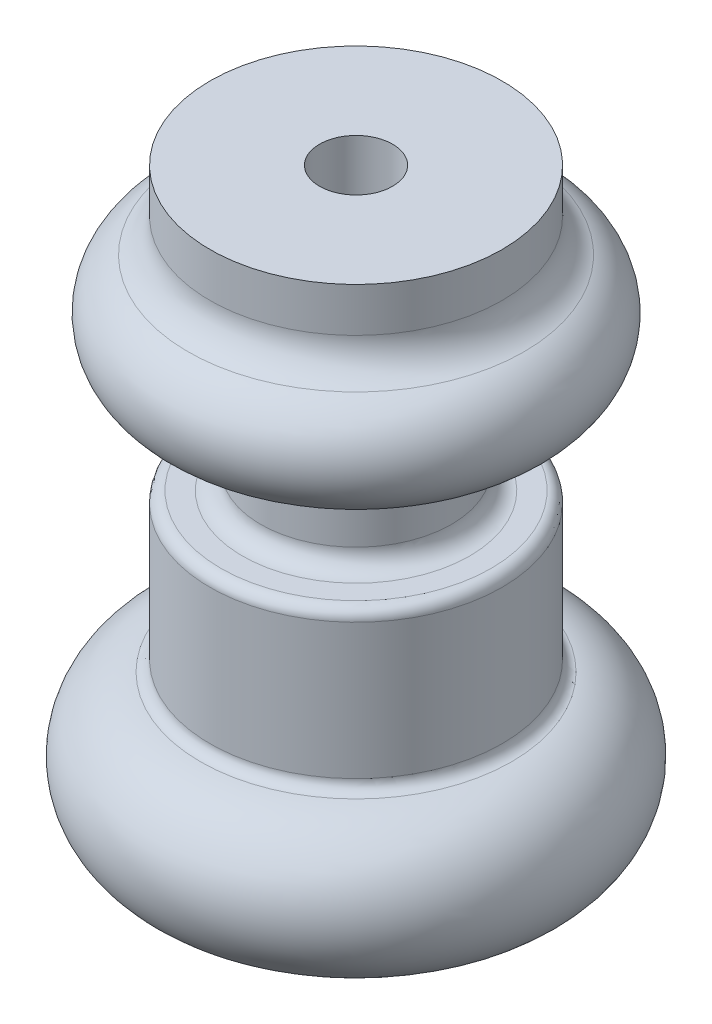
ISO-10303-21;
HEADER;
FILE_DESCRIPTION(('STEP AP214'),'2;1');
FILE_NAME('part.step','',(''),(''),'','','');
FILE_SCHEMA(('AUTOMOTIVE_DESIGN { 1 0 10303 214 1 1 1 1 }'));
ENDSEC;
DATA;
#1=APPLICATION_CONTEXT('core data for automotive mechanical design processes');
#2=APPLICATION_PROTOCOL_DEFINITION('international standard','automotive_design',2000,#1);
#3=PRODUCT_CONTEXT('',#1,'mechanical');
#4=PRODUCT('Part','Part','',(#3));
#5=PRODUCT_RELATED_PRODUCT_CATEGORY('part','',(#4));
#6=PRODUCT_DEFINITION_FORMATION('','',#4);
#7=PRODUCT_DEFINITION_CONTEXT('part definition',#1,'design');
#8=PRODUCT_DEFINITION('design','',#6,#7);
#9=PRODUCT_DEFINITION_SHAPE('','',#8);
#10=(LENGTH_UNIT() NAMED_UNIT(*) SI_UNIT(.MILLI.,.METRE.));
#11=(NAMED_UNIT(*) PLANE_ANGLE_UNIT() SI_UNIT($,.RADIAN.));
#12=(NAMED_UNIT(*) SI_UNIT($,.STERADIAN.) SOLID_ANGLE_UNIT());
#13=UNCERTAINTY_MEASURE_WITH_UNIT(LENGTH_MEASURE(1.E-05),#10,'distance_accuracy_value','');
#14=(GEOMETRIC_REPRESENTATION_CONTEXT(3) GLOBAL_UNCERTAINTY_ASSIGNED_CONTEXT((#13)) GLOBAL_UNIT_ASSIGNED_CONTEXT((#10,
#11,#12)) REPRESENTATION_CONTEXT('',''));
#15=CARTESIAN_POINT('',(0.,0.,0.));
#16=DIRECTION('',(0.,0.,1.));
#17=DIRECTION('',(1.,0.,0.));
#18=AXIS2_PLACEMENT_3D('',#15,#16,#17);
#19=CARTESIAN_POINT('',(0.,0.,0.));
#20=DIRECTION('',(0.,-1.,0.));
#21=DIRECTION('',(1.,0.,0.));
#22=AXIS2_PLACEMENT_3D('',#19,#20,#21);
#23=PLANE('',#22);
#24=CARTESIAN_POINT('',(0.,-2.22044604925031E-13,0.));
#25=DIRECTION('',(0.,-1.,0.));
#26=DIRECTION('',(1.,0.,0.));
#27=AXIS2_PLACEMENT_3D('',#24,#25,#26);
#28=CIRCLE('',#27,40.);
#29=CARTESIAN_POINT('',(40.,0.,0.));
#30=VERTEX_POINT('',#29);
#31=EDGE_CURVE('E10',#30,#30,#28,.T.);
#32=ORIENTED_EDGE('',*,*,#31,.T.);
#33=EDGE_LOOP('',(#32));
#34=FACE_BOUND('',#33,.T.);
#35=ADVANCED_FACE('F42',(#34),#23,.T.);
#36=CARTESIAN_POINT('',(0.,19.9999999999998,0.));
#37=DIRECTION('',(0.,-1.,0.));
#38=DIRECTION('',(1.,0.,0.));
#39=AXIS2_PLACEMENT_3D('',#36,#37,#38);
#40=TOROIDAL_SURFACE('',#39,40.0000000000001,20.);
#41=CARTESIAN_POINT('',(-1.36623860160332E-13,39.8291378278108,0.));
#42=DIRECTION('',(0.,-1.,0.));
#43=DIRECTION('',(1.,0.,0.));
#44=AXIS2_PLACEMENT_3D('',#41,#42,#43);
#45=CIRCLE('',#44,42.608695652174);
#46=CARTESIAN_POINT('',(42.6086956521739,39.829137827811,0.));
#47=VERTEX_POINT('',#46);
#48=EDGE_CURVE('E48',#47,#47,#45,.T.);
#49=ORIENTED_EDGE('',*,*,#48,.T.);
#50=EDGE_LOOP('',(#49));
#51=FACE_BOUND('',#50,.T.);
#52=ORIENTED_EDGE('',*,*,#31,.F.);
#53=EDGE_LOOP('',(#52));
#54=FACE_BOUND('',#53,.T.);
#55=ADVANCED_FACE('F179',(#51,#54),#40,.T.);
#56=CARTESIAN_POINT('',(-1.45716771982052E-13,42.8035085019825,0.));
#57=DIRECTION('',(0.,-1.,0.));
#58=DIRECTION('',(1.,0.,0.));
#59=AXIS2_PLACEMENT_3D('',#56,#57,#58);
#60=TOROIDAL_SURFACE('',#59,43.0000000000001,3.);
#61=CARTESIAN_POINT('',(-1.46826692187723E-13,42.8035085019824,0.));
#62=DIRECTION('',(0.,-1.,0.));
#63=DIRECTION('',(1.,0.,0.));
#64=AXIS2_PLACEMENT_3D('',#61,#62,#63);
#65=CIRCLE('',#64,40.0000000000002);
#66=CARTESIAN_POINT('',(40.,42.8035085019826,0.));
#67=VERTEX_POINT('',#66);
#68=EDGE_CURVE('E52',#67,#67,#65,.T.);
#69=ORIENTED_EDGE('',*,*,#68,.T.);
#70=EDGE_LOOP('',(#69));
#71=FACE_BOUND('',#70,.T.);
#72=ORIENTED_EDGE('',*,*,#48,.F.);
#73=EDGE_LOOP('',(#72));
#74=FACE_BOUND('',#73,.T.);
#75=ADVANCED_FACE('F176',(#71,#74),#60,.F.);
#76=CARTESIAN_POINT('',(4.49721271568111E-12,-1311.04555883317,0.));
#77=DIRECTION('',(0.,-1.,0.));
#78=DIRECTION('',(1.,0.,0.));
#79=AXIS2_PLACEMENT_3D('',#76,#77,#78);
#80=CYLINDRICAL_SURFACE('',#79,40.0000000000002);
#81=CARTESIAN_POINT('',(-2.74012710224512E-13,79.8812885926119,0.));
#82=DIRECTION('',(0.,-1.,0.));
#83=DIRECTION('',(1.,0.,0.));
#84=AXIS2_PLACEMENT_3D('',#81,#82,#83);
#85=CIRCLE('',#84,40.0000000000003);
#86=CARTESIAN_POINT('',(40.,79.881288592612,0.));
#87=VERTEX_POINT('',#86);
#88=EDGE_CURVE('E56',#87,#87,#85,.T.);
#89=ORIENTED_EDGE('',*,*,#88,.T.);
#90=EDGE_LOOP('',(#89));
#91=FACE_BOUND('',#90,.T.);
#92=ORIENTED_EDGE('',*,*,#68,.F.);
#93=EDGE_LOOP('',(#92));
#94=FACE_BOUND('',#93,.T.);
#95=ADVANCED_FACE('F172',(#91,#94),#80,.T.);
#96=CARTESIAN_POINT('',(-2.77555756156289E-13,79.8812885926118,0.));
#97=DIRECTION('',(0.,-1.,0.));
#98=DIRECTION('',(1.,0.,0.));
#99=AXIS2_PLACEMENT_3D('',#96,#97,#98);
#100=TOROIDAL_SURFACE('',#99,37.0000000000003,3.);
#101=CARTESIAN_POINT('',(-2.84303457221168E-13,82.8812885926118,0.));
#102=DIRECTION('',(0.,-1.,0.));
#103=DIRECTION('',(1.,0.,0.));
#104=AXIS2_PLACEMENT_3D('',#101,#102,#103);
#105=CIRCLE('',#104,37.0000000000003);
#106=CARTESIAN_POINT('',(37.,82.8812885926119,0.));
#107=VERTEX_POINT('',#106);
#108=EDGE_CURVE('E61',#107,#107,#105,.T.);
#109=ORIENTED_EDGE('',*,*,#108,.T.);
#110=EDGE_LOOP('',(#109));
#111=FACE_BOUND('',#110,.T.);
#112=ORIENTED_EDGE('',*,*,#88,.F.);
#113=EDGE_LOOP('',(#112));
#114=FACE_BOUND('',#113,.T.);
#115=ADVANCED_FACE('F168',(#111,#114),#100,.T.);
#116=CARTESIAN_POINT('',(31.1292101273217,82.881288592612,0.));
#117=DIRECTION('',(0.,1.,0.));
#118=DIRECTION('',(-1.,0.,0.));
#119=AXIS2_PLACEMENT_3D('',#116,#117,#118);
#120=PLANE('',#119);
#121=CARTESIAN_POINT('',(-2.84303457221169E-13,82.881288592612,0.));
#122=DIRECTION('',(0.,-1.,0.));
#123=DIRECTION('',(1.,0.,0.));
#124=AXIS2_PLACEMENT_3D('',#121,#122,#123);
#125=CIRCLE('',#124,31.129210127322);
#126=CARTESIAN_POINT('',(31.1292101273217,82.8812885926121,0.));
#127=VERTEX_POINT('',#126);
#128=EDGE_CURVE('E64',#127,#127,#125,.T.);
#129=ORIENTED_EDGE('',*,*,#128,.T.);
#130=EDGE_LOOP('',(#129));
#131=FACE_BOUND('',#130,.T.);
#132=ORIENTED_EDGE('',*,*,#108,.F.);
#133=EDGE_LOOP('',(#132));
#134=FACE_BOUND('',#133,.T.);
#135=ADVANCED_FACE('F164',(#131,#134),#120,.T.);
#136=CARTESIAN_POINT('',(-3.01841884819964E-13,87.8812885926121,0.));
#137=DIRECTION('',(0.,-1.,0.));
#138=DIRECTION('',(1.,0.,0.));
#139=AXIS2_PLACEMENT_3D('',#136,#137,#138);
#140=TOROIDAL_SURFACE('',#139,31.129210127322,5.);
#141=CARTESIAN_POINT('',(-3.01454702215599E-13,87.8812885926121,0.));
#142=DIRECTION('',(0.,-1.,0.));
#143=DIRECTION('',(1.,0.,0.));
#144=AXIS2_PLACEMENT_3D('',#141,#142,#143);
#145=CIRCLE('',#144,26.129210127322);
#146=CARTESIAN_POINT('',(26.1292101273217,87.8812885926122,0.));
#147=VERTEX_POINT('',#146);
#148=EDGE_CURVE('E67',#147,#147,#145,.T.);
#149=ORIENTED_EDGE('',*,*,#148,.T.);
#150=EDGE_LOOP('',(#149));
#151=FACE_BOUND('',#150,.T.);
#152=ORIENTED_EDGE('',*,*,#128,.F.);
#153=EDGE_LOOP('',(#152));
#154=FACE_BOUND('',#153,.T.);
#155=ADVANCED_FACE('F160',(#151,#154),#140,.F.);
#156=CARTESIAN_POINT('',(4.49721271568111E-12,-1311.04555883317,0.));
#157=DIRECTION('',(0.,-1.,0.));
#158=DIRECTION('',(1.,0.,0.));
#159=AXIS2_PLACEMENT_3D('',#156,#157,#158);
#160=CYLINDRICAL_SURFACE('',#159,26.129210127322);
#161=CARTESIAN_POINT('',(-3.43024899888577E-13,100.,0.));
#162=DIRECTION('',(0.,-1.,0.));
#163=DIRECTION('',(1.,0.,0.));
#164=AXIS2_PLACEMENT_3D('',#161,#162,#163);
#165=CIRCLE('',#164,26.129210127322);
#166=CARTESIAN_POINT('',(26.1292101273217,100.,0.));
#167=VERTEX_POINT('',#166);
#168=EDGE_CURVE('E70',#167,#167,#165,.T.);
#169=ORIENTED_EDGE('',*,*,#168,.T.);
#170=EDGE_LOOP('',(#169));
#171=FACE_BOUND('',#170,.T.);
#172=ORIENTED_EDGE('',*,*,#148,.F.);
#173=EDGE_LOOP('',(#172));
#174=FACE_BOUND('',#173,.T.);
#175=ADVANCED_FACE('F156',(#171,#174),#160,.T.);
#176=CARTESIAN_POINT('',(-3.46944695195361E-13,99.9999999999998,0.));
#177=DIRECTION('',(0.,-1.,0.));
#178=DIRECTION('',(1.,0.,0.));
#179=AXIS2_PLACEMENT_3D('',#176,#177,#178);
#180=TOROIDAL_SURFACE('',#179,36.129210127322,10.);
#181=CARTESIAN_POINT('',(-3.77327389877434E-13,110.,0.));
#182=DIRECTION('',(0.,-1.,0.));
#183=DIRECTION('',(1.,0.,0.));
#184=AXIS2_PLACEMENT_3D('',#181,#182,#183);
#185=CIRCLE('',#184,36.129210127322);
#186=CARTESIAN_POINT('',(36.1292101273217,110.,0.));
#187=VERTEX_POINT('',#186);
#188=EDGE_CURVE('E73',#187,#187,#185,.T.);
#189=ORIENTED_EDGE('',*,*,#188,.T.);
#190=EDGE_LOOP('',(#189));
#191=FACE_BOUND('',#190,.T.);
#192=ORIENTED_EDGE('',*,*,#168,.F.);
#193=EDGE_LOOP('',(#192));
#194=FACE_BOUND('',#193,.T.);
#195=ADVANCED_FACE('F152',(#191,#194),#180,.F.);
#196=CARTESIAN_POINT('',(36.1292101273217,110.,0.));
#197=DIRECTION('',(0.,-1.,0.));
#198=DIRECTION('',(1.,0.,0.));
#199=AXIS2_PLACEMENT_3D('',#196,#197,#198);
#200=PLANE('',#199);
#201=CARTESIAN_POINT('',(-3.77327389877434E-13,110.,0.));
#202=DIRECTION('',(0.,-1.,0.));
#203=DIRECTION('',(1.,0.,0.));
#204=AXIS2_PLACEMENT_3D('',#201,#202,#203);
#205=CIRCLE('',#204,40.0000000000004);
#206=CARTESIAN_POINT('',(40.,110.,0.));
#207=VERTEX_POINT('',#206);
#208=EDGE_CURVE('E76',#207,#207,#205,.T.);
#209=ORIENTED_EDGE('',*,*,#208,.T.);
#210=EDGE_LOOP('',(#209));
#211=FACE_BOUND('',#210,.T.);
#212=ORIENTED_EDGE('',*,*,#188,.F.);
#213=EDGE_LOOP('',(#212));
#214=FACE_BOUND('',#213,.T.);
#215=ADVANCED_FACE('F148',(#211,#214),#200,.T.);
#216=CARTESIAN_POINT('',(-4.30211422042248E-13,125.,0.));
#217=DIRECTION('',(0.,-1.,0.));
#218=DIRECTION('',(1.,0.,0.));
#219=AXIS2_PLACEMENT_3D('',#216,#217,#218);
#220=TOROIDAL_SURFACE('',#219,40.0000000000004,15.);
#221=CARTESIAN_POINT('',(-4.75939251930542E-13,138.747727084867,0.));
#222=DIRECTION('',(0.,-1.,0.));
#223=DIRECTION('',(1.,0.,0.));
#224=AXIS2_PLACEMENT_3D('',#221,#222,#223);
#225=CIRCLE('',#224,46.0000000000005);
#226=CARTESIAN_POINT('',(46.,138.747727084868,0.));
#227=VERTEX_POINT('',#226);
#228=EDGE_CURVE('E79',#227,#227,#225,.T.);
#229=ORIENTED_EDGE('',*,*,#228,.T.);
#230=EDGE_LOOP('',(#229));
#231=FACE_BOUND('',#230,.T.);
#232=ORIENTED_EDGE('',*,*,#208,.F.);
#233=EDGE_LOOP('',(#232));
#234=FACE_BOUND('',#233,.T.);
#235=ADVANCED_FACE('F144',(#231,#234),#220,.T.);
#236=CARTESIAN_POINT('',(-5.06539254985228E-13,147.912878474779,0.));
#237=DIRECTION('',(0.,-1.,0.));
#238=DIRECTION('',(1.,0.,0.));
#239=AXIS2_PLACEMENT_3D('',#236,#237,#238);
#240=TOROIDAL_SURFACE('',#239,50.0000000000005,9.99999999999999);
#241=CARTESIAN_POINT('',(-5.07378003310423E-13,147.912878474779,0.));
#242=DIRECTION('',(0.,-1.,0.));
#243=DIRECTION('',(1.,0.,0.));
#244=AXIS2_PLACEMENT_3D('',#241,#242,#243);
#245=CIRCLE('',#244,40.0000000000005);
#246=CARTESIAN_POINT('',(40.,147.912878474779,0.));
#247=VERTEX_POINT('',#246);
#248=EDGE_CURVE('E82',#247,#247,#245,.T.);
#249=ORIENTED_EDGE('',*,*,#248,.T.);
#250=EDGE_LOOP('',(#249));
#251=FACE_BOUND('',#250,.T.);
#252=ORIENTED_EDGE('',*,*,#228,.F.);
#253=EDGE_LOOP('',(#252));
#254=FACE_BOUND('',#253,.T.);
#255=ADVANCED_FACE('F140',(#251,#254),#240,.F.);
#256=CARTESIAN_POINT('',(4.49721271568111E-12,-1311.04555883317,0.));
#257=DIRECTION('',(0.,-1.,0.));
#258=DIRECTION('',(1.,0.,0.));
#259=AXIS2_PLACEMENT_3D('',#256,#257,#258);
#260=CYLINDRICAL_SURFACE('',#259,40.0000000000005);
#261=CARTESIAN_POINT('',(-5.48839839821722E-13,160.,0.));
#262=DIRECTION('',(0.,-1.,0.));
#263=DIRECTION('',(1.,0.,0.));
#264=AXIS2_PLACEMENT_3D('',#261,#262,#263);
#265=CIRCLE('',#264,40.0000000000005);
#266=CARTESIAN_POINT('',(40.,160.,0.));
#267=VERTEX_POINT('',#266);
#268=EDGE_CURVE('E85',#267,#267,#265,.T.);
#269=ORIENTED_EDGE('',*,*,#268,.T.);
#270=EDGE_LOOP('',(#269));
#271=FACE_BOUND('',#270,.T.);
#272=ORIENTED_EDGE('',*,*,#248,.F.);
#273=EDGE_LOOP('',(#272));
#274=FACE_BOUND('',#273,.T.);
#275=ADVANCED_FACE('F136',(#271,#274),#260,.T.);
#276=CARTESIAN_POINT('',(40.,160.,0.));
#277=DIRECTION('',(0.,1.,0.));
#278=DIRECTION('',(-1.,0.,0.));
#279=AXIS2_PLACEMENT_3D('',#276,#277,#278);
#280=PLANE('',#279);
#281=CARTESIAN_POINT('',(-5.48839839821723E-13,160.,0.));
#282=DIRECTION('',(0.,-1.,0.));
#283=DIRECTION('',(1.,0.,0.));
#284=AXIS2_PLACEMENT_3D('',#281,#282,#283);
#285=CIRCLE('',#284,10.0000000000006);
#286=CARTESIAN_POINT('',(10.,160.,0.));
#287=VERTEX_POINT('',#286);
#288=EDGE_CURVE('E88',#287,#287,#285,.T.);
#289=ORIENTED_EDGE('',*,*,#288,.T.);
#290=EDGE_LOOP('',(#289));
#291=FACE_BOUND('',#290,.T.);
#292=ORIENTED_EDGE('',*,*,#268,.F.);
#293=EDGE_LOOP('',(#292));
#294=FACE_BOUND('',#293,.T.);
#295=ADVANCED_FACE('F132',(#291,#294),#280,.T.);
#296=CARTESIAN_POINT('',(4.49721271568111E-12,-1311.04555883317,0.));
#297=DIRECTION('',(0.,-1.,0.));
#298=DIRECTION('',(1.,0.,0.));
#299=AXIS2_PLACEMENT_3D('',#296,#297,#298);
#300=CYLINDRICAL_SURFACE('',#299,10.0000000000005);
#301=CARTESIAN_POINT('',(-4.11629879866291E-13,120.,0.));
#302=DIRECTION('',(0.,-1.,0.));
#303=DIRECTION('',(1.,0.,0.));
#304=AXIS2_PLACEMENT_3D('',#301,#302,#303);
#305=CIRCLE('',#304,10.0000000000004);
#306=CARTESIAN_POINT('',(10.,120.,0.));
#307=VERTEX_POINT('',#306);
#308=EDGE_CURVE('E91',#307,#307,#305,.T.);
#309=ORIENTED_EDGE('',*,*,#308,.T.);
#310=EDGE_LOOP('',(#309));
#311=FACE_BOUND('',#310,.T.);
#312=ORIENTED_EDGE('',*,*,#288,.F.);
#313=EDGE_LOOP('',(#312));
#314=FACE_BOUND('',#313,.T.);
#315=ADVANCED_FACE('F128',(#311,#314),#300,.F.);
#316=CARTESIAN_POINT('',(10.,120.,0.));
#317=DIRECTION('',(0.,1.,0.));
#318=DIRECTION('',(-1.,0.,0.));
#319=AXIS2_PLACEMENT_3D('',#316,#317,#318);
#320=PLANE('',#319);
#321=ORIENTED_EDGE('',*,*,#308,.F.);
#322=EDGE_LOOP('',(#321));
#323=FACE_BOUND('',#322,.T.);
#324=ADVANCED_FACE('F126',(#323),#320,.T.);
#325=CLOSED_SHELL('',(#35,#55,#75,#95,#115,#135,#155,#175,#195,#215,#235,#255,#275,#295,#315,#324));
#326=CARTESIAN_POINT('',(4.49721271568111E-12,-1311.04555883317,0.));
#327=DIRECTION('',(0.,-1.,0.));
#328=DIRECTION('',(1.,0.,0.));
#329=AXIS2_PLACEMENT_3D('',#326,#327,#328);
#330=CYLINDRICAL_SURFACE('',#329,20.0000000000001);
#331=CARTESIAN_POINT('',(0.,20.,0.));
#332=DIRECTION('',(0.,-1.,0.));
#333=DIRECTION('',(1.,0.,0.));
#334=AXIS2_PLACEMENT_3D('',#331,#332,#333);
#335=CIRCLE('',#334,20.0000000000001);
#336=CARTESIAN_POINT('',(20.,20.0000000000001,0.));
#337=VERTEX_POINT('',#336);
#338=EDGE_CURVE('E94',#337,#337,#335,.T.);
#339=ORIENTED_EDGE('',*,*,#338,.F.);
#340=EDGE_LOOP('',(#339));
#341=FACE_BOUND('',#340,.T.);
#342=CARTESIAN_POINT('',(-1.46826692187724E-13,42.8035085019827,0.));
#343=DIRECTION('',(0.,-1.,0.));
#344=DIRECTION('',(1.,0.,0.));
#345=AXIS2_PLACEMENT_3D('',#342,#343,#344);
#346=CIRCLE('',#345,20.0000000000002);
#347=CARTESIAN_POINT('',(20.,42.8035085019827,0.));
#348=VERTEX_POINT('',#347);
#349=EDGE_CURVE('E100',#348,#348,#346,.T.);
#350=ORIENTED_EDGE('',*,*,#349,.T.);
#351=EDGE_LOOP('',(#350));
#352=FACE_BOUND('',#351,.T.);
#353=ADVANCED_FACE('F104',(#341,#352),#330,.T.);
#354=CARTESIAN_POINT('',(0.,19.9999999999999,0.));
#355=DIRECTION('',(0.,-1.,0.));
#356=DIRECTION('',(1.,0.,0.));
#357=AXIS2_PLACEMENT_3D('',#354,#355,#356);
#358=PLANE('',#357);
#359=CARTESIAN_POINT('',(0.,19.9999999999998,0.));
#360=DIRECTION('',(0.,-1.,0.));
#361=DIRECTION('',(1.,0.,0.));
#362=AXIS2_PLACEMENT_3D('',#359,#360,#361);
#363=CIRCLE('',#362,40.0000000000001);
#364=CARTESIAN_POINT('',(40.,19.9999999999999,0.));
#365=VERTEX_POINT('',#364);
#366=EDGE_CURVE('E97',#365,#365,#363,.T.);
#367=ORIENTED_EDGE('',*,*,#366,.F.);
#368=EDGE_LOOP('',(#367));
#369=FACE_BOUND('',#368,.T.);
#370=ORIENTED_EDGE('',*,*,#338,.T.);
#371=EDGE_LOOP('',(#370));
#372=FACE_BOUND('',#371,.T.);
#373=ADVANCED_FACE('F109',(#369,#372),#358,.F.);
#374=CARTESIAN_POINT('',(-1.45716771982052E-13,42.8035085019825,0.));
#375=DIRECTION('',(0.,-1.,0.));
#376=DIRECTION('',(1.,0.,0.));
#377=AXIS2_PLACEMENT_3D('',#374,#375,#376);
#378=TOROIDAL_SURFACE('',#377,43.0000000000001,23.);
#379=ORIENTED_EDGE('',*,*,#349,.F.);
#380=EDGE_LOOP('',(#379));
#381=FACE_BOUND('',#380,.T.);
#382=ORIENTED_EDGE('',*,*,#366,.T.);
#383=EDGE_LOOP('',(#382));
#384=FACE_BOUND('',#383,.T.);
#385=ADVANCED_FACE('F106',(#381,#384),#378,.T.);
#386=CLOSED_SHELL('',(#353,#373,#385));
#387=ORIENTED_CLOSED_SHELL('',*,#386,.T.);
#388=BREP_WITH_VOIDS('B2',#325,(#387));
#389=ADVANCED_BREP_SHAPE_REPRESENTATION('',(#18,#388),#14);
#390=SHAPE_DEFINITION_REPRESENTATION(#9,#389);
ENDSEC;
END-ISO-10303-21;
